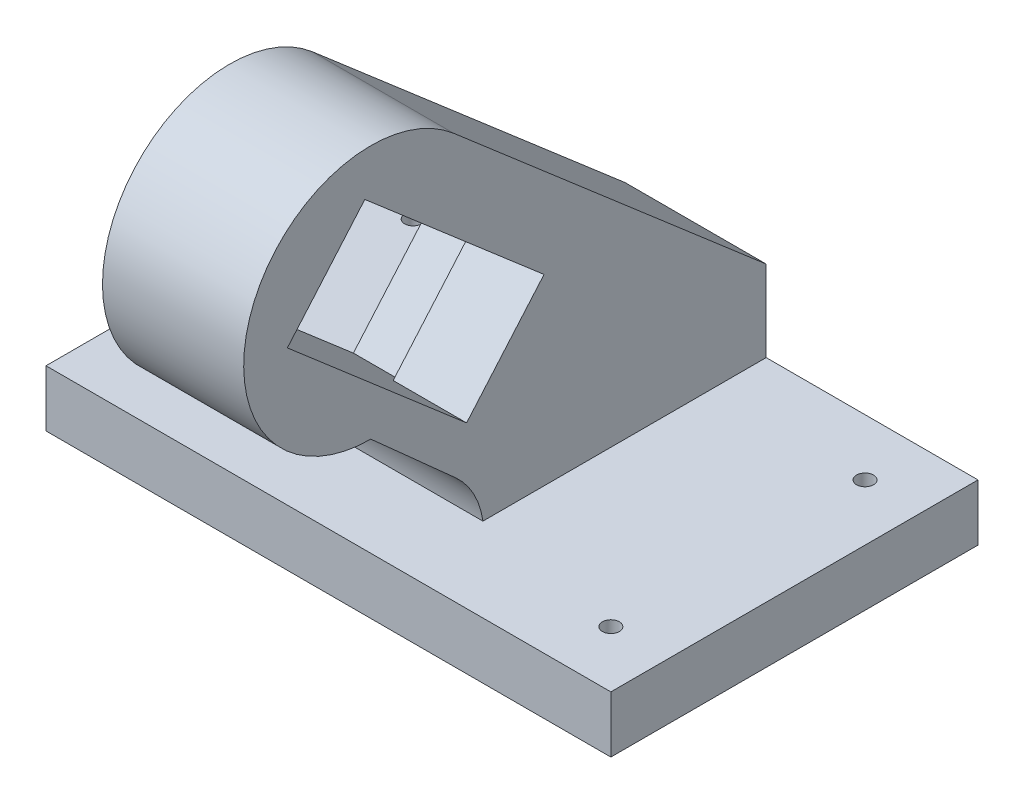
ISO-10303-21;
HEADER;
FILE_DESCRIPTION(('STEP AP214'),'2;1');
FILE_NAME('part.step','',(''),(''),'','','');
FILE_SCHEMA(('AUTOMOTIVE_DESIGN { 1 0 10303 214 1 1 1 1 }'));
ENDSEC;
DATA;
#1=APPLICATION_CONTEXT('core data for automotive mechanical design processes');
#2=APPLICATION_PROTOCOL_DEFINITION('international standard','automotive_design',2000,#1);
#3=PRODUCT_CONTEXT('',#1,'mechanical');
#4=PRODUCT('Part','Part','',(#3));
#5=PRODUCT_RELATED_PRODUCT_CATEGORY('part','',(#4));
#6=PRODUCT_DEFINITION_FORMATION('','',#4);
#7=PRODUCT_DEFINITION_CONTEXT('part definition',#1,'design');
#8=PRODUCT_DEFINITION('design','',#6,#7);
#9=PRODUCT_DEFINITION_SHAPE('','',#8);
#10=(LENGTH_UNIT() NAMED_UNIT(*) SI_UNIT(.MILLI.,.METRE.));
#11=(NAMED_UNIT(*) PLANE_ANGLE_UNIT() SI_UNIT($,.RADIAN.));
#12=(NAMED_UNIT(*) SI_UNIT($,.STERADIAN.) SOLID_ANGLE_UNIT());
#13=UNCERTAINTY_MEASURE_WITH_UNIT(LENGTH_MEASURE(1.E-05),#10,'distance_accuracy_value','');
#14=(GEOMETRIC_REPRESENTATION_CONTEXT(3) GLOBAL_UNCERTAINTY_ASSIGNED_CONTEXT((#13)) GLOBAL_UNIT_ASSIGNED_CONTEXT((#10,
#11,#12)) REPRESENTATION_CONTEXT('',''));
#15=CARTESIAN_POINT('',(0.,0.,0.));
#16=DIRECTION('',(0.,0.,1.));
#17=DIRECTION('',(1.,0.,0.));
#18=AXIS2_PLACEMENT_3D('',#15,#16,#17);
#19=CARTESIAN_POINT('',(0.,10.,0.));
#20=DIRECTION('',(0.,-1.,0.));
#21=DIRECTION('',(0.,0.,-1.));
#22=AXIS2_PLACEMENT_3D('',#19,#20,#21);
#23=PLANE('',#22);
#24=CARTESIAN_POINT('',(-40.,9.99999999999999,-40.));
#25=DIRECTION('',(0.,-1.,0.));
#26=DIRECTION('',(0.,0.,-1.));
#27=AXIS2_PLACEMENT_3D('',#24,#25,#26);
#28=CIRCLE('',#27,1.5);
#29=CARTESIAN_POINT('',(-40.,9.99999999999999,-41.5));
#30=VERTEX_POINT('',#29);
#31=EDGE_CURVE('E353',#30,#30,#28,.T.);
#32=ORIENTED_EDGE('',*,*,#31,.T.);
#33=EDGE_LOOP('',(#32));
#34=FACE_BOUND('',#33,.T.);
#35=CARTESIAN_POINT('',(40.,9.99999999999999,-40.));
#36=DIRECTION('',(0.,-1.,0.));
#37=DIRECTION('',(0.,0.,-1.));
#38=AXIS2_PLACEMENT_3D('',#35,#36,#37);
#39=CIRCLE('',#38,1.5);
#40=CARTESIAN_POINT('',(40.,9.99999999999999,-41.5));
#41=VERTEX_POINT('',#40);
#42=EDGE_CURVE('E357',#41,#41,#39,.T.);
#43=ORIENTED_EDGE('',*,*,#42,.T.);
#44=EDGE_LOOP('',(#43));
#45=FACE_BOUND('',#44,.T.);
#46=CARTESIAN_POINT('',(40.,9.99999999999999,5.00000000000001));
#47=DIRECTION('',(0.,-1.,0.));
#48=DIRECTION('',(0.,0.,-1.));
#49=AXIS2_PLACEMENT_3D('',#46,#47,#48);
#50=CIRCLE('',#49,1.5);
#51=CARTESIAN_POINT('',(40.,9.99999999999999,3.50000000000001));
#52=VERTEX_POINT('',#51);
#53=EDGE_CURVE('E366',#52,#52,#50,.T.);
#54=ORIENTED_EDGE('',*,*,#53,.T.);
#55=EDGE_LOOP('',(#54));
#56=FACE_BOUND('',#55,.T.);
#57=CARTESIAN_POINT('',(-40.,9.99999999999999,5.));
#58=DIRECTION('',(0.,-1.,0.));
#59=DIRECTION('',(0.,0.,-1.));
#60=AXIS2_PLACEMENT_3D('',#57,#58,#59);
#61=CIRCLE('',#60,1.5);
#62=CARTESIAN_POINT('',(-40.,9.99999999999999,3.5));
#63=VERTEX_POINT('',#62);
#64=EDGE_CURVE('E169',#63,#63,#61,.T.);
#65=ORIENTED_EDGE('',*,*,#64,.T.);
#66=EDGE_LOOP('',(#65));
#67=FACE_BOUND('',#66,.T.);
#68=DIRECTION('',(1.,0.,0.));
#69=VECTOR('',#68,1.);
#70=CARTESIAN_POINT('',(-50.,10.,15.));
#71=LINE('',#70,#69);
#72=CARTESIAN_POINT('',(-50.,10.,15.));
#73=VERTEX_POINT('',#72);
#74=CARTESIAN_POINT('',(50.,10.,15.));
#75=VERTEX_POINT('',#74);
#76=EDGE_CURVE('E162',#73,#75,#71,.T.);
#77=ORIENTED_EDGE('',*,*,#76,.T.);
#78=DIRECTION('',(0.,0.,-1.));
#79=VECTOR('',#78,1.);
#80=CARTESIAN_POINT('',(50.,10.,50.));
#81=LINE('',#80,#79);
#82=CARTESIAN_POINT('',(50.,10.,-50.));
#83=VERTEX_POINT('',#82);
#84=EDGE_CURVE('E41',#75,#83,#81,.T.);
#85=ORIENTED_EDGE('',*,*,#84,.T.);
#86=DIRECTION('',(-1.,0.,0.));
#87=VECTOR('',#86,1.);
#88=CARTESIAN_POINT('',(-50.,10.,-50.));
#89=LINE('',#88,#87);
#90=CARTESIAN_POINT('',(12.5,10.,-50.));
#91=VERTEX_POINT('',#90);
#92=EDGE_CURVE('E186',#83,#91,#89,.T.);
#93=ORIENTED_EDGE('',*,*,#92,.T.);
#94=DIRECTION('',(0.,0.,-1.));
#95=VECTOR('',#94,1.);
#96=CARTESIAN_POINT('',(12.5,10.,50.));
#97=LINE('',#96,#95);
#98=CARTESIAN_POINT('',(12.5,10.,0.14726796638424));
#99=VERTEX_POINT('',#98);
#100=EDGE_CURVE('E218',#99,#91,#97,.T.);
#101=ORIENTED_EDGE('',*,*,#100,.F.);
#102=DIRECTION('',(-1.,0.,0.));
#103=VECTOR('',#102,1.);
#104=CARTESIAN_POINT('',(50.000025,10.,0.14726796638424));
#105=LINE('',#104,#103);
#106=CARTESIAN_POINT('',(-12.5,10.,0.14726796638424));
#107=VERTEX_POINT('',#106);
#108=EDGE_CURVE('E436',#99,#107,#105,.T.);
#109=ORIENTED_EDGE('',*,*,#108,.T.);
#110=DIRECTION('',(0.,0.,1.));
#111=VECTOR('',#110,1.);
#112=CARTESIAN_POINT('',(-12.5,10.,50.));
#113=LINE('',#112,#111);
#114=CARTESIAN_POINT('',(-12.5,10.,-50.));
#115=VERTEX_POINT('',#114);
#116=EDGE_CURVE('E213',#115,#107,#113,.T.);
#117=ORIENTED_EDGE('',*,*,#116,.F.);
#118=CARTESIAN_POINT('',(-50.,10.,-50.));
#119=VERTEX_POINT('',#118);
#120=EDGE_CURVE('E183',#115,#119,#89,.T.);
#121=ORIENTED_EDGE('',*,*,#120,.T.);
#122=DIRECTION('',(0.,0.,1.));
#123=VECTOR('',#122,1.);
#124=CARTESIAN_POINT('',(-50.,10.,50.));
#125=LINE('',#124,#123);
#126=EDGE_CURVE('E176',#119,#73,#125,.T.);
#127=ORIENTED_EDGE('',*,*,#126,.T.);
#128=EDGE_LOOP('',(#77,#85,#93,#101,#109,#117,#121,#127));
#129=FACE_BOUND('',#128,.T.);
#130=ADVANCED_FACE('F37',(#34,#45,#56,#67,#129),#23,.F.);
#131=CARTESIAN_POINT('',(50.,10.,50.));
#132=DIRECTION('',(-1.,0.,0.));
#133=DIRECTION('',(0.,0.,1.));
#134=AXIS2_PLACEMENT_3D('',#131,#132,#133);
#135=PLANE('',#134);
#136=DIRECTION('',(0.,1.,0.));
#137=VECTOR('',#136,1.);
#138=CARTESIAN_POINT('',(50.,-2.5E-05,15.));
#139=LINE('',#138,#137);
#140=CARTESIAN_POINT('',(50.,0.,15.));
#141=VERTEX_POINT('',#140);
#142=EDGE_CURVE('E165',#141,#75,#139,.T.);
#143=ORIENTED_EDGE('',*,*,#142,.F.);
#144=DIRECTION('',(0.,0.,-1.));
#145=VECTOR('',#144,1.);
#146=CARTESIAN_POINT('',(50.,0.,50.));
#147=LINE('',#146,#145);
#148=CARTESIAN_POINT('',(50.,0.,-50.));
#149=VERTEX_POINT('',#148);
#150=EDGE_CURVE('E204',#141,#149,#147,.T.);
#151=ORIENTED_EDGE('',*,*,#150,.T.);
#152=DIRECTION('',(0.,-1.,0.));
#153=VECTOR('',#152,1.);
#154=CARTESIAN_POINT('',(50.,10.,-50.));
#155=LINE('',#154,#153);
#156=EDGE_CURVE('E188',#83,#149,#155,.T.);
#157=ORIENTED_EDGE('',*,*,#156,.F.);
#158=ORIENTED_EDGE('',*,*,#84,.F.);
#159=EDGE_LOOP('',(#143,#151,#157,#158));
#160=FACE_BOUND('',#159,.T.);
#161=ADVANCED_FACE('F39',(#160),#135,.F.);
#162=CARTESIAN_POINT('',(-50.,10.,50.));
#163=DIRECTION('',(1.,0.,0.));
#164=DIRECTION('',(0.,0.,-1.));
#165=AXIS2_PLACEMENT_3D('',#162,#163,#164);
#166=PLANE('',#165);
#167=DIRECTION('',(0.,1.,0.));
#168=VECTOR('',#167,1.);
#169=CARTESIAN_POINT('',(-50.,-2.5E-05,15.));
#170=LINE('',#169,#168);
#171=CARTESIAN_POINT('',(-50.,0.,15.));
#172=VERTEX_POINT('',#171);
#173=EDGE_CURVE('E54',#172,#73,#170,.T.);
#174=ORIENTED_EDGE('',*,*,#173,.T.);
#175=ORIENTED_EDGE('',*,*,#126,.F.);
#176=DIRECTION('',(0.,-1.,0.));
#177=VECTOR('',#176,1.);
#178=CARTESIAN_POINT('',(-50.,10.,-50.));
#179=LINE('',#178,#177);
#180=CARTESIAN_POINT('',(-50.,0.,-50.));
#181=VERTEX_POINT('',#180);
#182=EDGE_CURVE('E185',#119,#181,#179,.T.);
#183=ORIENTED_EDGE('',*,*,#182,.T.);
#184=DIRECTION('',(0.,0.,1.));
#185=VECTOR('',#184,1.);
#186=CARTESIAN_POINT('',(-50.,0.,50.));
#187=LINE('',#186,#185);
#188=EDGE_CURVE('E178',#181,#172,#187,.T.);
#189=ORIENTED_EDGE('',*,*,#188,.T.);
#190=EDGE_LOOP('',(#174,#175,#183,#189));
#191=FACE_BOUND('',#190,.T.);
#192=ADVANCED_FACE('F174',(#191),#166,.F.);
#193=CARTESIAN_POINT('',(0.,0.,0.));
#194=DIRECTION('',(0.,-1.,0.));
#195=DIRECTION('',(0.,0.,-1.));
#196=AXIS2_PLACEMENT_3D('',#193,#194,#195);
#197=PLANE('',#196);
#198=CARTESIAN_POINT('',(-40.,0.,-40.));
#199=DIRECTION('',(0.,-1.,0.));
#200=DIRECTION('',(0.,0.,1.));
#201=AXIS2_PLACEMENT_3D('',#198,#199,#200);
#202=CIRCLE('',#201,1.5);
#203=CARTESIAN_POINT('',(-40.,0.,-38.5));
#204=VERTEX_POINT('',#203);
#205=EDGE_CURVE('E351',#204,#204,#202,.T.);
#206=ORIENTED_EDGE('',*,*,#205,.F.);
#207=EDGE_LOOP('',(#206));
#208=FACE_BOUND('',#207,.T.);
#209=CARTESIAN_POINT('',(40.,0.,-40.));
#210=DIRECTION('',(0.,-1.,0.));
#211=DIRECTION('',(0.,0.,-1.));
#212=AXIS2_PLACEMENT_3D('',#209,#210,#211);
#213=CIRCLE('',#212,1.5);
#214=CARTESIAN_POINT('',(40.,0.,-41.5));
#215=VERTEX_POINT('',#214);
#216=EDGE_CURVE('E354',#215,#215,#213,.T.);
#217=ORIENTED_EDGE('',*,*,#216,.F.);
#218=EDGE_LOOP('',(#217));
#219=FACE_BOUND('',#218,.T.);
#220=CARTESIAN_POINT('',(40.,0.,5.00000000000001));
#221=DIRECTION('',(0.,-1.,0.));
#222=DIRECTION('',(0.,0.,1.));
#223=AXIS2_PLACEMENT_3D('',#220,#221,#222);
#224=CIRCLE('',#223,1.5);
#225=CARTESIAN_POINT('',(40.,0.,6.50000000000001));
#226=VERTEX_POINT('',#225);
#227=EDGE_CURVE('E363',#226,#226,#224,.T.);
#228=ORIENTED_EDGE('',*,*,#227,.F.);
#229=EDGE_LOOP('',(#228));
#230=FACE_BOUND('',#229,.T.);
#231=CARTESIAN_POINT('',(-40.,0.,5.));
#232=DIRECTION('',(0.,-1.,0.));
#233=DIRECTION('',(0.,0.,-1.));
#234=AXIS2_PLACEMENT_3D('',#231,#232,#233);
#235=CIRCLE('',#234,1.5);
#236=CARTESIAN_POINT('',(-40.,0.,3.5));
#237=VERTEX_POINT('',#236);
#238=EDGE_CURVE('E369',#237,#237,#235,.T.);
#239=ORIENTED_EDGE('',*,*,#238,.F.);
#240=EDGE_LOOP('',(#239));
#241=FACE_BOUND('',#240,.T.);
#242=ORIENTED_EDGE('',*,*,#150,.F.);
#243=DIRECTION('',(-1.,0.,0.));
#244=VECTOR('',#243,1.);
#245=CARTESIAN_POINT('',(0.,0.,15.));
#246=LINE('',#245,#244);
#247=EDGE_CURVE('E11',#141,#172,#246,.T.);
#248=ORIENTED_EDGE('',*,*,#247,.T.);
#249=ORIENTED_EDGE('',*,*,#188,.F.);
#250=DIRECTION('',(-1.,0.,0.));
#251=VECTOR('',#250,1.);
#252=CARTESIAN_POINT('',(-50.,0.,-50.));
#253=LINE('',#252,#251);
#254=EDGE_CURVE('E206',#149,#181,#253,.T.);
#255=ORIENTED_EDGE('',*,*,#254,.F.);
#256=EDGE_LOOP('',(#242,#248,#249,#255));
#257=FACE_BOUND('',#256,.T.);
#258=ADVANCED_FACE('F262',(#208,#219,#230,#241,#257),#197,.T.);
#259=CARTESIAN_POINT('',(50.0001250000001,12.8088879917078,14.8539900616322));
#260=DIRECTION('',(0.,0.653048539095701,0.757316053959621));
#261=DIRECTION('',(0.,-0.757316053959621,0.653048539095701));
#262=AXIS2_PLACEMENT_3D('',#259,#260,#261);
#263=PLANE('',#262);
#264=DIRECTION('',(-1.,0.,0.));
#265=VECTOR('',#264,1.);
#266=CARTESIAN_POINT('',(50.0001250000001,42.4134420120163,-10.6745995575349));
#267=LINE('',#266,#265);
#268=CARTESIAN_POINT('',(12.5,42.4134420120163,-10.6745995575349));
#269=VERTEX_POINT('',#268);
#270=CARTESIAN_POINT('',(-0.499999999999976,42.4134420120162,-10.6745995575349));
#271=VERTEX_POINT('',#270);
#272=EDGE_CURVE('E408',#269,#271,#267,.T.);
#273=ORIENTED_EDGE('',*,*,#272,.T.);
#274=DIRECTION('',(0.,-0.757316053959621,0.653048539095701));
#275=VECTOR('',#274,1.);
#276=CARTESIAN_POINT('',(-0.49999999999998,12.8088879917078,14.8539900616322));
#277=LINE('',#276,#275);
#278=CARTESIAN_POINT('',(-0.49999999999998,26.509804878864,3.03941976347474));
#279=VERTEX_POINT('',#278);
#280=EDGE_CURVE('E404',#271,#279,#277,.T.);
#281=ORIENTED_EDGE('',*,*,#280,.T.);
#282=DIRECTION('',(-1.,0.,0.));
#283=VECTOR('',#282,1.);
#284=CARTESIAN_POINT('',(50.0001250000001,26.509804878864,3.03941976347474));
#285=LINE('',#284,#283);
#286=CARTESIAN_POINT('',(12.5,26.509804878864,3.03941976347474));
#287=VERTEX_POINT('',#286);
#288=EDGE_CURVE('E407',#287,#279,#285,.T.);
#289=ORIENTED_EDGE('',*,*,#288,.F.);
#290=DIRECTION('',(0.,0.757316053959621,-0.653048539095701));
#291=VECTOR('',#290,1.);
#292=CARTESIAN_POINT('',(12.5,51.1687174724521,-18.224445911542));
#293=LINE('',#292,#291);
#294=EDGE_CURVE('E426',#287,#269,#293,.T.);
#295=ORIENTED_EDGE('',*,*,#294,.T.);
#296=EDGE_LOOP('',(#273,#281,#289,#295));
#297=FACE_BOUND('',#296,.T.);
#298=ADVANCED_FACE('F264',(#297),#263,.T.);
#299=CARTESIAN_POINT('',(50.0001250000001,40.1716217798175,46.5855327225403));
#300=DIRECTION('',(0.,-0.653048539095699,-0.757316053959622));
#301=DIRECTION('',(0.,0.757316053959622,-0.653048539095699));
#302=AXIS2_PLACEMENT_3D('',#299,#300,#301);
#303=PLANE('',#302);
#304=DIRECTION('',(-1.,0.,0.));
#305=VECTOR('',#304,1.);
#306=CARTESIAN_POINT('',(50.0001250000001,53.872538666974,34.7709624243829));
#307=LINE('',#306,#305);
#308=CARTESIAN_POINT('',(12.5,53.8725386669741,34.7709624243829));
#309=VERTEX_POINT('',#308);
#310=CARTESIAN_POINT('',(-0.499999999999976,53.872538666974,34.7709624243829));
#311=VERTEX_POINT('',#310);
#312=EDGE_CURVE('E415',#309,#311,#307,.T.);
#313=ORIENTED_EDGE('',*,*,#312,.T.);
#314=DIRECTION('',(0.,0.757316053959622,-0.653048539095699));
#315=VECTOR('',#314,1.);
#316=CARTESIAN_POINT('',(-0.49999999999998,40.1716217798175,46.5855327225403));
#317=LINE('',#316,#315);
#318=CARTESIAN_POINT('',(-0.49999999999998,69.7761758001259,21.0569431033731));
#319=VERTEX_POINT('',#318);
#320=EDGE_CURVE('E394',#311,#319,#317,.T.);
#321=ORIENTED_EDGE('',*,*,#320,.T.);
#322=DIRECTION('',(-1.,0.,0.));
#323=VECTOR('',#322,1.);
#324=CARTESIAN_POINT('',(50.0001250000001,69.7761758001259,21.0569431033731));
#325=LINE('',#324,#323);
#326=CARTESIAN_POINT('',(12.5,69.7761758001259,21.0569431033731));
#327=VERTEX_POINT('',#326);
#328=EDGE_CURVE('E412',#327,#319,#325,.T.);
#329=ORIENTED_EDGE('',*,*,#328,.F.);
#330=DIRECTION('',(0.,-0.757316053959622,0.653048539095699));
#331=VECTOR('',#330,1.);
#332=CARTESIAN_POINT('',(12.5,78.5314512605621,13.5070967493661));
#333=LINE('',#332,#331);
#334=EDGE_CURVE('E421',#327,#309,#333,.T.);
#335=ORIENTED_EDGE('',*,*,#334,.T.);
#336=EDGE_LOOP('',(#313,#321,#329,#335));
#337=FACE_BOUND('',#336,.T.);
#338=ADVANCED_FACE('F271',(#337),#303,.T.);
#339=CARTESIAN_POINT('',(12.5,110.,50.));
#340=DIRECTION('',(-1.,0.,0.));
#341=DIRECTION('',(0.,0.,1.));
#342=AXIS2_PLACEMENT_3D('',#339,#340,#341);
#343=PLANE('',#342);
#344=DIRECTION('',(0.,-0.6530485390957,-0.757316053959621));
#345=VECTOR('',#344,1.);
#346=CARTESIAN_POINT('',(12.5,110.33251718708,49.7132638848587));
#347=LINE('',#346,#345);
#348=CARTESIAN_POINT('',(12.5,72.0396112140915,5.30640787034676));
#349=VERTEX_POINT('',#348);
#350=CARTESIAN_POINT('',(12.5,24.3478071469264,-50.));
#351=VERTEX_POINT('',#350);
#352=EDGE_CURVE('E440',#349,#351,#347,.T.);
#353=ORIENTED_EDGE('',*,*,#352,.F.);
#354=CARTESIAN_POINT('',(12.5,55.,20.));
#355=DIRECTION('',(-1.,0.,0.));
#356=DIRECTION('',(0.,0.,1.));
#357=AXIS2_PLACEMENT_3D('',#354,#355,#356);
#358=CIRCLE('',#357,22.5);
#359=CARTESIAN_POINT('',(12.5,32.5,20.));
#360=VERTEX_POINT('',#359);
#361=EDGE_CURVE('E441',#360,#349,#358,.T.);
#362=ORIENTED_EDGE('',*,*,#361,.F.);
#363=DIRECTION('',(0.,0.666666666666667,0.74535599249993));
#364=VECTOR('',#363,1.);
#365=CARTESIAN_POINT('',(12.5,81.8515642944431,75.176726279163));
#366=LINE('',#365,#364);
#367=CARTESIAN_POINT('',(12.5,19.0835921350013,5.00000000000001));
#368=VERTEX_POINT('',#367);
#369=EDGE_CURVE('E225',#368,#360,#366,.T.);
#370=ORIENTED_EDGE('',*,*,#369,.F.);
#371=CARTESIAN_POINT('',(12.5,7.90325224750232,15.));
#372=DIRECTION('',(-1.,0.,0.));
#373=DIRECTION('',(0.,0.,1.));
#374=AXIS2_PLACEMENT_3D('',#371,#372,#373);
#375=CIRCLE('',#374,15.);
#376=EDGE_CURVE('E256',#368,#99,#375,.T.);
#377=ORIENTED_EDGE('',*,*,#376,.T.);
#378=ORIENTED_EDGE('',*,*,#100,.T.);
#379=DIRECTION('',(0.,-1.,0.));
#380=VECTOR('',#379,1.);
#381=CARTESIAN_POINT('',(12.5,110.,-50.));
#382=LINE('',#381,#380);
#383=EDGE_CURVE('E195',#351,#91,#382,.T.);
#384=ORIENTED_EDGE('',*,*,#383,.F.);
#385=EDGE_LOOP('',(#353,#362,#370,#377,#378,#384));
#386=FACE_BOUND('',#385,.T.);
#387=ORIENTED_EDGE('',*,*,#294,.F.);
#388=DIRECTION('',(0.,-0.6530485390957,-0.757316053959621));
#389=VECTOR('',#388,1.);
#390=CARTESIAN_POINT('',(12.5,85.3410874064121,71.2638656750168));
#391=LINE('',#390,#389);
#392=EDGE_CURVE('E411',#309,#287,#391,.T.);
#393=ORIENTED_EDGE('',*,*,#392,.F.);
#394=ORIENTED_EDGE('',*,*,#334,.F.);
#395=DIRECTION('',(0.,0.6530485390957,0.757316053959621));
#396=VECTOR('',#395,1.);
#397=CARTESIAN_POINT('',(12.5,101.244724539564,57.5498463540071));
#398=LINE('',#397,#396);
#399=EDGE_CURVE('E424',#269,#327,#398,.T.);
#400=ORIENTED_EDGE('',*,*,#399,.F.);
#401=EDGE_LOOP('',(#387,#393,#394,#400));
#402=FACE_BOUND('',#401,.T.);
#403=ADVANCED_FACE('F253',(#386,#402),#343,.F.);
#404=CARTESIAN_POINT('',(-12.5,110.,50.));
#405=DIRECTION('',(1.,0.,0.));
#406=DIRECTION('',(0.,0.,-1.));
#407=AXIS2_PLACEMENT_3D('',#404,#405,#406);
#408=PLANE('',#407);
#409=DIRECTION('',(0.,0.6530485390957,0.757316053959621));
#410=VECTOR('',#409,1.);
#411=CARTESIAN_POINT('',(-12.5,110.33251718708,49.7132638848587));
#412=LINE('',#411,#410);
#413=CARTESIAN_POINT('',(-12.5,24.3478071469264,-50.));
#414=VERTEX_POINT('',#413);
#415=CARTESIAN_POINT('',(-12.5,72.0396112140915,5.30640787034676));
#416=VERTEX_POINT('',#415);
#417=EDGE_CURVE('E229',#414,#416,#412,.T.);
#418=ORIENTED_EDGE('',*,*,#417,.F.);
#419=DIRECTION('',(0.,-1.,0.));
#420=VECTOR('',#419,1.);
#421=CARTESIAN_POINT('',(-12.5,110.,-50.));
#422=LINE('',#421,#420);
#423=EDGE_CURVE('E217',#414,#115,#422,.T.);
#424=ORIENTED_EDGE('',*,*,#423,.T.);
#425=ORIENTED_EDGE('',*,*,#116,.T.);
#426=CARTESIAN_POINT('',(-12.5,7.90325224750232,15.));
#427=DIRECTION('',(1.,0.,0.));
#428=DIRECTION('',(0.,0.,-1.));
#429=AXIS2_PLACEMENT_3D('',#426,#427,#428);
#430=CIRCLE('',#429,15.);
#431=CARTESIAN_POINT('',(-12.5,19.0835921350013,5.));
#432=VERTEX_POINT('',#431);
#433=EDGE_CURVE('E210',#107,#432,#430,.T.);
#434=ORIENTED_EDGE('',*,*,#433,.T.);
#435=DIRECTION('',(0.,-0.666666666666667,-0.74535599249993));
#436=VECTOR('',#435,1.);
#437=CARTESIAN_POINT('',(-12.5,81.8515642944431,75.176726279163));
#438=LINE('',#437,#436);
#439=CARTESIAN_POINT('',(-12.5,32.5,20.));
#440=VERTEX_POINT('',#439);
#441=EDGE_CURVE('E233',#440,#432,#438,.T.);
#442=ORIENTED_EDGE('',*,*,#441,.F.);
#443=CARTESIAN_POINT('',(-12.5,55.,20.));
#444=DIRECTION('',(1.,0.,0.));
#445=DIRECTION('',(0.,0.,-1.));
#446=AXIS2_PLACEMENT_3D('',#443,#444,#445);
#447=CIRCLE('',#446,22.5);
#448=EDGE_CURVE('E231',#416,#440,#447,.T.);
#449=ORIENTED_EDGE('',*,*,#448,.F.);
#450=EDGE_LOOP('',(#418,#424,#425,#434,#442,#449));
#451=FACE_BOUND('',#450,.T.);
#452=DIRECTION('',(0.,-0.6530485390957,-0.757316053959621));
#453=VECTOR('',#452,1.);
#454=CARTESIAN_POINT('',(-12.5,101.244724539564,57.5498463540071));
#455=LINE('',#454,#453);
#456=CARTESIAN_POINT('',(-12.5,74.053643731203,26.0173632568088));
#457=VERTEX_POINT('',#456);
#458=CARTESIAN_POINT('',(-12.5,38.1359740809393,-15.6350197109704));
#459=VERTEX_POINT('',#458);
#460=EDGE_CURVE('E47',#457,#459,#455,.T.);
#461=ORIENTED_EDGE('',*,*,#460,.F.);
#462=DIRECTION('',(0.,0.75731605395962,-0.653048539095701));
#463=VECTOR('',#462,1.);
#464=CARTESIAN_POINT('',(-12.5,58.1500065980509,39.7313825778185));
#465=LINE('',#464,#463);
#466=CARTESIAN_POINT('',(-12.5,58.1500065980509,39.7313825778185));
#467=VERTEX_POINT('',#466);
#468=EDGE_CURVE('E388',#467,#457,#465,.T.);
#469=ORIENTED_EDGE('',*,*,#468,.F.);
#470=DIRECTION('',(0.,0.6530485390957,0.757316053959621));
#471=VECTOR('',#470,1.);
#472=CARTESIAN_POINT('',(-12.5,85.3410874064121,71.2638656750168));
#473=LINE('',#472,#471);
#474=CARTESIAN_POINT('',(-12.5,22.2323369477873,-1.92100038996083));
#475=VERTEX_POINT('',#474);
#476=EDGE_CURVE('E198',#475,#467,#473,.T.);
#477=ORIENTED_EDGE('',*,*,#476,.F.);
#478=DIRECTION('',(0.,-0.757316053959623,0.653048539095698));
#479=VECTOR('',#478,1.);
#480=CARTESIAN_POINT('',(-12.5,38.1359740809393,-15.6350197109704));
#481=LINE('',#480,#479);
#482=EDGE_CURVE('E179',#459,#475,#481,.T.);
#483=ORIENTED_EDGE('',*,*,#482,.F.);
#484=EDGE_LOOP('',(#461,#469,#477,#483));
#485=FACE_BOUND('',#484,.T.);
#486=ADVANCED_FACE('F288',(#451,#485),#408,.F.);
#487=CARTESIAN_POINT('',(-50.,10.,-50.));
#488=DIRECTION('',(0.,0.,1.));
#489=DIRECTION('',(1.,0.,0.));
#490=AXIS2_PLACEMENT_3D('',#487,#488,#489);
#491=PLANE('',#490);
#492=DIRECTION('',(-1.,0.,0.));
#493=VECTOR('',#492,1.);
#494=CARTESIAN_POINT('',(50.000025,24.3478071469264,-50.));
#495=LINE('',#494,#493);
#496=EDGE_CURVE('E248',#351,#414,#495,.T.);
#497=ORIENTED_EDGE('',*,*,#496,.F.);
#498=ORIENTED_EDGE('',*,*,#383,.T.);
#499=ORIENTED_EDGE('',*,*,#92,.F.);
#500=ORIENTED_EDGE('',*,*,#156,.T.);
#501=ORIENTED_EDGE('',*,*,#254,.T.);
#502=ORIENTED_EDGE('',*,*,#182,.F.);
#503=ORIENTED_EDGE('',*,*,#120,.F.);
#504=ORIENTED_EDGE('',*,*,#423,.F.);
#505=EDGE_LOOP('',(#497,#498,#499,#500,#501,#502,#503,#504));
#506=FACE_BOUND('',#505,.T.);
#507=ADVANCED_FACE('F246',(#506),#491,.F.);
#508=CARTESIAN_POINT('',(50.000025,8.11747565555648,-7.26049094860959));
#509=DIRECTION('',(0.,-0.745355992499929,0.666666666666667));
#510=DIRECTION('',(0.,-0.666666666666667,-0.74535599249993));
#511=AXIS2_PLACEMENT_3D('',#508,#509,#510);
#512=PLANE('',#511);
#513=ORIENTED_EDGE('',*,*,#369,.T.);
#514=DIRECTION('',(-1.,0.,0.));
#515=VECTOR('',#514,1.);
#516=CARTESIAN_POINT('',(50.000025,32.5,20.));
#517=LINE('',#516,#515);
#518=EDGE_CURVE('E429',#360,#440,#517,.T.);
#519=ORIENTED_EDGE('',*,*,#518,.T.);
#520=ORIENTED_EDGE('',*,*,#441,.T.);
#521=DIRECTION('',(-1.,0.,0.));
#522=VECTOR('',#521,1.);
#523=CARTESIAN_POINT('',(50.000025,19.0835921350013,5.00000000000001));
#524=LINE('',#523,#522);
#525=EDGE_CURVE('E428',#368,#432,#524,.T.);
#526=ORIENTED_EDGE('',*,*,#525,.F.);
#527=EDGE_LOOP('',(#513,#519,#520,#526));
#528=FACE_BOUND('',#527,.T.);
#529=ADVANCED_FACE('F291',(#528),#512,.T.);
#530=CARTESIAN_POINT('',(50.000025,55.,20.));
#531=DIRECTION('',(-1.,0.,0.));
#532=DIRECTION('',(0.,0.,1.));
#533=AXIS2_PLACEMENT_3D('',#530,#531,#532);
#534=CYLINDRICAL_SURFACE('',#533,22.5);
#535=ORIENTED_EDGE('',*,*,#361,.T.);
#536=DIRECTION('',(-1.,0.,0.));
#537=VECTOR('',#536,1.);
#538=CARTESIAN_POINT('',(50.000025,72.0396112140915,5.30640787034676));
#539=LINE('',#538,#537);
#540=EDGE_CURVE('E432',#349,#416,#539,.T.);
#541=ORIENTED_EDGE('',*,*,#540,.T.);
#542=ORIENTED_EDGE('',*,*,#448,.T.);
#543=ORIENTED_EDGE('',*,*,#518,.F.);
#544=EDGE_LOOP('',(#535,#541,#542,#543));
#545=FACE_BOUND('',#544,.T.);
#546=ADVANCED_FACE('F294',(#545),#534,.T.);
#547=CARTESIAN_POINT('',(50.000025,38.6923466678239,-33.3651720883155));
#548=DIRECTION('',(0.,0.757316053959621,-0.6530485390957));
#549=DIRECTION('',(0.,0.6530485390957,0.757316053959621));
#550=AXIS2_PLACEMENT_3D('',#547,#548,#549);
#551=PLANE('',#550);
#552=ORIENTED_EDGE('',*,*,#352,.T.);
#553=ORIENTED_EDGE('',*,*,#496,.T.);
#554=ORIENTED_EDGE('',*,*,#417,.T.);
#555=ORIENTED_EDGE('',*,*,#540,.F.);
#556=EDGE_LOOP('',(#552,#553,#554,#555));
#557=FACE_BOUND('',#556,.T.);
#558=ADVANCED_FACE('F300',(#557),#551,.T.);
#559=CARTESIAN_POINT('',(50.000025,7.90325224750232,15.));
#560=DIRECTION('',(-1.,0.,0.));
#561=DIRECTION('',(0.,0.,1.));
#562=AXIS2_PLACEMENT_3D('',#559,#560,#561);
#563=CYLINDRICAL_SURFACE('',#562,15.);
#564=ORIENTED_EDGE('',*,*,#525,.T.);
#565=ORIENTED_EDGE('',*,*,#433,.F.);
#566=ORIENTED_EDGE('',*,*,#108,.F.);
#567=ORIENTED_EDGE('',*,*,#376,.F.);
#568=EDGE_LOOP('',(#564,#565,#566,#567));
#569=FACE_BOUND('',#568,.T.);
#570=ADVANCED_FACE('F296',(#569),#563,.F.);
#571=CARTESIAN_POINT('',(50.0001250000001,29.6045540203085,-25.5285896191671));
#572=DIRECTION('',(0.,-0.757316053959621,0.6530485390957));
#573=DIRECTION('',(0.,-0.6530485390957,-0.757316053959621));
#574=AXIS2_PLACEMENT_3D('',#571,#572,#573);
#575=PLANE('',#574);
#576=ORIENTED_EDGE('',*,*,#460,.T.);
#577=DIRECTION('',(-1.,0.,0.));
#578=VECTOR('',#577,1.);
#579=CARTESIAN_POINT('',(-0.499999999999976,38.1359740809393,-15.6350197109704));
#580=LINE('',#579,#578);
#581=CARTESIAN_POINT('',(-0.499999999999976,38.1359740809393,-15.6350197109704));
#582=VERTEX_POINT('',#581);
#583=EDGE_CURVE('E385',#582,#459,#580,.T.);
#584=ORIENTED_EDGE('',*,*,#583,.F.);
#585=DIRECTION('',(0.,-0.653048539095703,-0.757316053959619));
#586=VECTOR('',#585,1.);
#587=CARTESIAN_POINT('',(-0.499999999999976,74.053643731203,26.0173632568088));
#588=LINE('',#587,#586);
#589=EDGE_CURVE('E377',#271,#582,#588,.T.);
#590=ORIENTED_EDGE('',*,*,#589,.F.);
#591=ORIENTED_EDGE('',*,*,#272,.F.);
#592=ORIENTED_EDGE('',*,*,#399,.T.);
#593=ORIENTED_EDGE('',*,*,#328,.T.);
#594=CARTESIAN_POINT('',(-0.499999999999976,74.053643731203,26.0173632568088));
#595=VERTEX_POINT('',#594);
#596=EDGE_CURVE('E61',#595,#319,#588,.T.);
#597=ORIENTED_EDGE('',*,*,#596,.F.);
#598=DIRECTION('',(-1.,0.,0.));
#599=VECTOR('',#598,1.);
#600=CARTESIAN_POINT('',(-0.499999999999976,74.053643731203,26.0173632568088));
#601=LINE('',#600,#599);
#602=EDGE_CURVE('E391',#595,#457,#601,.T.);
#603=ORIENTED_EDGE('',*,*,#602,.T.);
#604=EDGE_LOOP('',(#576,#584,#590,#591,#592,#593,#597,#603));
#605=FACE_BOUND('',#604,.T.);
#606=ADVANCED_FACE('F299',(#605),#575,.T.);
#607=CARTESIAN_POINT('',(50.0001250000001,13.7009168871564,-11.8145702981574));
#608=DIRECTION('',(0.,0.757316053959621,-0.6530485390957));
#609=DIRECTION('',(0.,0.6530485390957,0.757316053959621));
#610=AXIS2_PLACEMENT_3D('',#607,#608,#609);
#611=PLANE('',#610);
#612=ORIENTED_EDGE('',*,*,#476,.T.);
#613=DIRECTION('',(-1.,0.,0.));
#614=VECTOR('',#613,1.);
#615=CARTESIAN_POINT('',(-0.499999999999976,58.1500065980509,39.7313825778185));
#616=LINE('',#615,#614);
#617=CARTESIAN_POINT('',(-0.499999999999976,58.1500065980509,39.7313825778185));
#618=VERTEX_POINT('',#617);
#619=EDGE_CURVE('E395',#618,#467,#616,.T.);
#620=ORIENTED_EDGE('',*,*,#619,.F.);
#621=DIRECTION('',(0.,0.653048539095699,0.757316053959622));
#622=VECTOR('',#621,1.);
#623=CARTESIAN_POINT('',(-0.499999999999976,22.2323369477873,-1.92100038996083));
#624=LINE('',#623,#622);
#625=EDGE_CURVE('E380',#311,#618,#624,.T.);
#626=ORIENTED_EDGE('',*,*,#625,.F.);
#627=ORIENTED_EDGE('',*,*,#312,.F.);
#628=ORIENTED_EDGE('',*,*,#392,.T.);
#629=ORIENTED_EDGE('',*,*,#288,.T.);
#630=CARTESIAN_POINT('',(-0.499999999999976,22.2323369477873,-1.92100038996083));
#631=VERTEX_POINT('',#630);
#632=EDGE_CURVE('E381',#631,#279,#624,.T.);
#633=ORIENTED_EDGE('',*,*,#632,.F.);
#634=DIRECTION('',(-1.,0.,0.));
#635=VECTOR('',#634,1.);
#636=CARTESIAN_POINT('',(-0.499999999999976,22.2323369477873,-1.92100038996083));
#637=LINE('',#636,#635);
#638=EDGE_CURVE('E398',#631,#475,#637,.T.);
#639=ORIENTED_EDGE('',*,*,#638,.T.);
#640=EDGE_LOOP('',(#612,#620,#626,#627,#628,#629,#633,#639));
#641=FACE_BOUND('',#640,.T.);
#642=ADVANCED_FACE('F308',(#641),#611,.T.);
#643=CARTESIAN_POINT('',(-0.499999999999976,0.,0.));
#644=DIRECTION('',(-1.,0.,0.));
#645=DIRECTION('',(0.,0.,1.));
#646=AXIS2_PLACEMENT_3D('',#643,#644,#645);
#647=PLANE('',#646);
#648=ORIENTED_EDGE('',*,*,#625,.T.);
#649=DIRECTION('',(0.,0.75731605395962,-0.653048539095701));
#650=VECTOR('',#649,1.);
#651=CARTESIAN_POINT('',(-0.499999999999976,58.1500065980509,39.7313825778185));
#652=LINE('',#651,#650);
#653=EDGE_CURVE('E383',#618,#595,#652,.T.);
#654=ORIENTED_EDGE('',*,*,#653,.T.);
#655=ORIENTED_EDGE('',*,*,#596,.T.);
#656=ORIENTED_EDGE('',*,*,#320,.F.);
#657=EDGE_LOOP('',(#648,#654,#655,#656));
#658=FACE_BOUND('',#657,.T.);
#659=ADVANCED_FACE('F311',(#658),#647,.T.);
#660=CARTESIAN_POINT('',(-0.499999999999976,58.1500065980509,39.7313825778185));
#661=DIRECTION('',(0.,0.653048539095701,0.75731605395962));
#662=DIRECTION('',(0.,-0.75731605395962,0.653048539095701));
#663=AXIS2_PLACEMENT_3D('',#660,#661,#662);
#664=PLANE('',#663);
#665=ORIENTED_EDGE('',*,*,#468,.T.);
#666=ORIENTED_EDGE('',*,*,#602,.F.);
#667=ORIENTED_EDGE('',*,*,#653,.F.);
#668=ORIENTED_EDGE('',*,*,#619,.T.);
#669=EDGE_LOOP('',(#665,#666,#667,#668));
#670=FACE_BOUND('',#669,.T.);
#671=ADVANCED_FACE('F324',(#670),#664,.F.);
#672=ORIENTED_EDGE('',*,*,#589,.T.);
#673=DIRECTION('',(0.,-0.757316053959623,0.653048539095698));
#674=VECTOR('',#673,1.);
#675=CARTESIAN_POINT('',(-0.499999999999976,38.1359740809393,-15.6350197109704));
#676=LINE('',#675,#674);
#677=EDGE_CURVE('E376',#582,#631,#676,.T.);
#678=ORIENTED_EDGE('',*,*,#677,.T.);
#679=ORIENTED_EDGE('',*,*,#632,.T.);
#680=ORIENTED_EDGE('',*,*,#280,.F.);
#681=EDGE_LOOP('',(#672,#678,#679,#680));
#682=FACE_BOUND('',#681,.T.);
#683=ADVANCED_FACE('F322',(#682),#647,.T.);
#684=CARTESIAN_POINT('',(-0.499999999999976,38.1359740809393,-15.6350197109704));
#685=DIRECTION('',(0.,-0.653048539095698,-0.757316053959623));
#686=DIRECTION('',(0.,0.757316053959623,-0.653048539095698));
#687=AXIS2_PLACEMENT_3D('',#684,#685,#686);
#688=PLANE('',#687);
#689=ORIENTED_EDGE('',*,*,#482,.T.);
#690=ORIENTED_EDGE('',*,*,#638,.F.);
#691=ORIENTED_EDGE('',*,*,#677,.F.);
#692=ORIENTED_EDGE('',*,*,#583,.T.);
#693=EDGE_LOOP('',(#689,#690,#691,#692));
#694=FACE_BOUND('',#693,.T.);
#695=ADVANCED_FACE('F319',(#694),#688,.F.);
#696=CARTESIAN_POINT('',(-50.,-2.5E-05,15.));
#697=DIRECTION('',(0.,0.,1.));
#698=DIRECTION('',(1.,0.,0.));
#699=AXIS2_PLACEMENT_3D('',#696,#697,#698);
#700=PLANE('',#699);
#701=ORIENTED_EDGE('',*,*,#142,.T.);
#702=ORIENTED_EDGE('',*,*,#76,.F.);
#703=ORIENTED_EDGE('',*,*,#173,.F.);
#704=ORIENTED_EDGE('',*,*,#247,.F.);
#705=EDGE_LOOP('',(#701,#702,#703,#704));
#706=FACE_BOUND('',#705,.T.);
#707=ADVANCED_FACE('F163',(#706),#700,.T.);
#708=CARTESIAN_POINT('',(-40.,77.5,5.));
#709=DIRECTION('',(0.,-1.,0.));
#710=DIRECTION('',(0.,0.,-1.));
#711=AXIS2_PLACEMENT_3D('',#708,#709,#710);
#712=CYLINDRICAL_SURFACE('',#711,1.5);
#713=ORIENTED_EDGE('',*,*,#238,.T.);
#714=EDGE_LOOP('',(#713));
#715=FACE_BOUND('',#714,.T.);
#716=ORIENTED_EDGE('',*,*,#64,.F.);
#717=EDGE_LOOP('',(#716));
#718=FACE_BOUND('',#717,.T.);
#719=ADVANCED_FACE('F332',(#715,#718),#712,.F.);
#720=CARTESIAN_POINT('',(40.,77.5,5.00000000000001));
#721=DIRECTION('',(0.,-1.,0.));
#722=DIRECTION('',(0.,0.,-1.));
#723=AXIS2_PLACEMENT_3D('',#720,#721,#722);
#724=CYLINDRICAL_SURFACE('',#723,1.5);
#725=ORIENTED_EDGE('',*,*,#227,.T.);
#726=EDGE_LOOP('',(#725));
#727=FACE_BOUND('',#726,.T.);
#728=ORIENTED_EDGE('',*,*,#53,.F.);
#729=EDGE_LOOP('',(#728));
#730=FACE_BOUND('',#729,.T.);
#731=ADVANCED_FACE('F335',(#727,#730),#724,.F.);
#732=CARTESIAN_POINT('',(40.,77.5,-40.));
#733=DIRECTION('',(0.,-1.,0.));
#734=DIRECTION('',(0.,0.,-1.));
#735=AXIS2_PLACEMENT_3D('',#732,#733,#734);
#736=CYLINDRICAL_SURFACE('',#735,1.5);
#737=ORIENTED_EDGE('',*,*,#216,.T.);
#738=EDGE_LOOP('',(#737));
#739=FACE_BOUND('',#738,.T.);
#740=ORIENTED_EDGE('',*,*,#42,.F.);
#741=EDGE_LOOP('',(#740));
#742=FACE_BOUND('',#741,.T.);
#743=ADVANCED_FACE('F339',(#739,#742),#736,.F.);
#744=CARTESIAN_POINT('',(-40.,77.5,-40.));
#745=DIRECTION('',(0.,-1.,0.));
#746=DIRECTION('',(0.,0.,-1.));
#747=AXIS2_PLACEMENT_3D('',#744,#745,#746);
#748=CYLINDRICAL_SURFACE('',#747,1.5);
#749=ORIENTED_EDGE('',*,*,#205,.T.);
#750=EDGE_LOOP('',(#749));
#751=FACE_BOUND('',#750,.T.);
#752=ORIENTED_EDGE('',*,*,#31,.F.);
#753=EDGE_LOOP('',(#752));
#754=FACE_BOUND('',#753,.T.);
#755=ADVANCED_FACE('F343',(#751,#754),#748,.F.);
#756=CLOSED_SHELL('',(#130,#161,#192,#258,#298,#338,#403,#486,#507,#529,#546,#558,#570,#606,
#642,#659,#671,#683,#695,#707,#719,#731,#743,#755));
#757=MANIFOLD_SOLID_BREP('B2',#756);
#758=ADVANCED_BREP_SHAPE_REPRESENTATION('',(#18,#757),#14);
#759=SHAPE_DEFINITION_REPRESENTATION(#9,#758);
ENDSEC;
END-ISO-10303-21;
